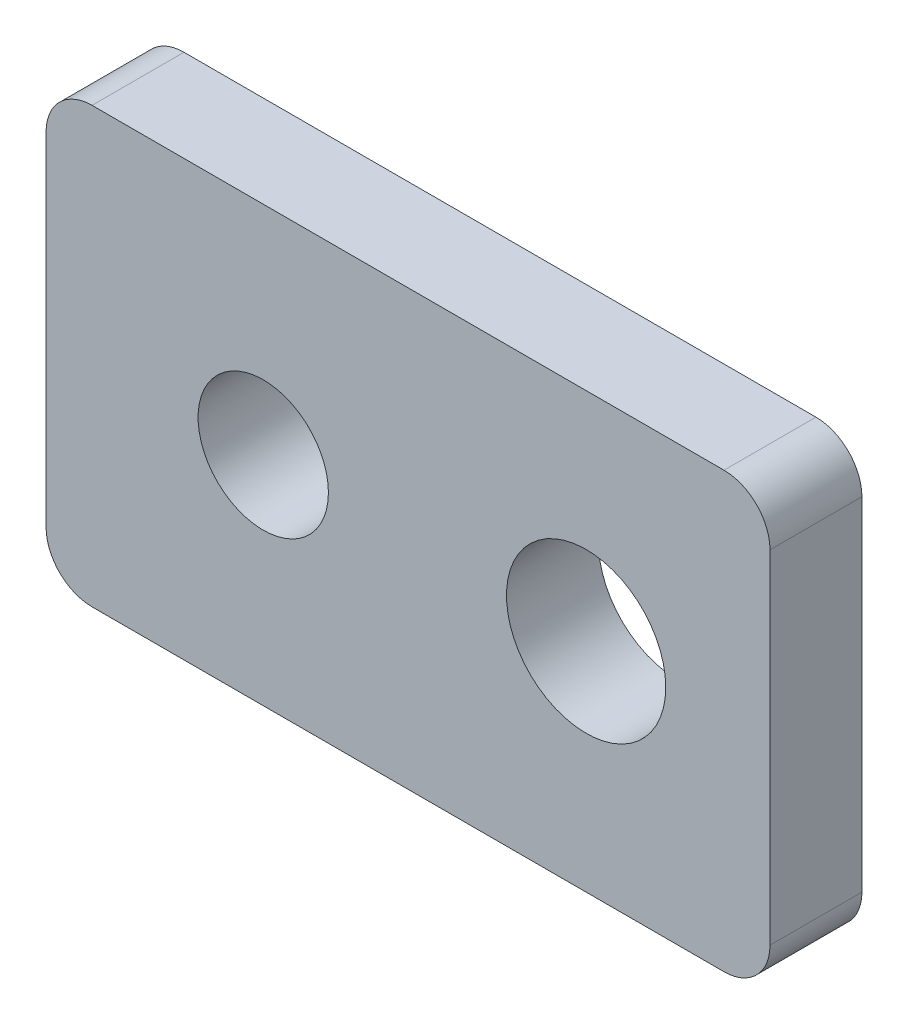
ISO-10303-21;
HEADER;
FILE_DESCRIPTION(('STEP AP214'),'2;1');
FILE_NAME('part.step','',(''),(''),'','','');
FILE_SCHEMA(('AUTOMOTIVE_DESIGN { 1 0 10303 214 1 1 1 1 }'));
ENDSEC;
DATA;
#1=APPLICATION_CONTEXT('core data for automotive mechanical design processes');
#2=APPLICATION_PROTOCOL_DEFINITION('international standard','automotive_design',2000,#1);
#3=PRODUCT_CONTEXT('',#1,'mechanical');
#4=PRODUCT('Part','Part','',(#3));
#5=PRODUCT_RELATED_PRODUCT_CATEGORY('part','',(#4));
#6=PRODUCT_DEFINITION_FORMATION('','',#4);
#7=PRODUCT_DEFINITION_CONTEXT('part definition',#1,'design');
#8=PRODUCT_DEFINITION('design','',#6,#7);
#9=PRODUCT_DEFINITION_SHAPE('','',#8);
#10=(LENGTH_UNIT() NAMED_UNIT(*) SI_UNIT(.MILLI.,.METRE.));
#11=(NAMED_UNIT(*) PLANE_ANGLE_UNIT() SI_UNIT($,.RADIAN.));
#12=(NAMED_UNIT(*) SI_UNIT($,.STERADIAN.) SOLID_ANGLE_UNIT());
#13=UNCERTAINTY_MEASURE_WITH_UNIT(LENGTH_MEASURE(1.E-05),#10,'distance_accuracy_value','');
#14=(GEOMETRIC_REPRESENTATION_CONTEXT(3) GLOBAL_UNCERTAINTY_ASSIGNED_CONTEXT((#13)) GLOBAL_UNIT_ASSIGNED_CONTEXT((#10,
#11,#12)) REPRESENTATION_CONTEXT('',''));
#15=CARTESIAN_POINT('',(0.,0.,0.));
#16=DIRECTION('',(0.,0.,1.));
#17=DIRECTION('',(1.,0.,0.));
#18=AXIS2_PLACEMENT_3D('',#15,#16,#17);
#19=CARTESIAN_POINT('',(12.5,0.,3.175));
#20=DIRECTION('',(1.,0.,0.));
#21=DIRECTION('',(0.,0.,-1.));
#22=AXIS2_PLACEMENT_3D('',#19,#20,#21);
#23=PLANE('',#22);
#24=DIRECTION('',(0.,-1.,0.));
#25=VECTOR('',#24,1.);
#26=CARTESIAN_POINT('',(12.5,0.,0.));
#27=LINE('',#26,#25);
#28=CARTESIAN_POINT('',(12.5,5.9125,0.));
#29=VERTEX_POINT('',#28);
#30=CARTESIAN_POINT('',(12.5,-5.9125,0.));
#31=VERTEX_POINT('',#30);
#32=EDGE_CURVE('E149',#29,#31,#27,.T.);
#33=ORIENTED_EDGE('',*,*,#32,.F.);
#34=DIRECTION('',(0.,0.,-1.));
#35=VECTOR('',#34,1.);
#36=CARTESIAN_POINT('',(12.5,5.9125,3.175));
#37=LINE('',#36,#35);
#38=CARTESIAN_POINT('',(12.5,5.9125,3.175));
#39=VERTEX_POINT('',#38);
#40=EDGE_CURVE('E11',#29,#39,#37,.F.);
#41=ORIENTED_EDGE('',*,*,#40,.T.);
#42=DIRECTION('',(0.,-1.,0.));
#43=VECTOR('',#42,1.);
#44=CARTESIAN_POINT('',(12.5,0.,3.175));
#45=LINE('',#44,#43);
#46=CARTESIAN_POINT('',(12.5,-5.9125,3.175));
#47=VERTEX_POINT('',#46);
#48=EDGE_CURVE('E147',#39,#47,#45,.T.);
#49=ORIENTED_EDGE('',*,*,#48,.T.);
#50=DIRECTION('',(0.,0.,-1.));
#51=VECTOR('',#50,1.);
#52=CARTESIAN_POINT('',(12.5,-5.9125,0.));
#53=LINE('',#52,#51);
#54=EDGE_CURVE('E56',#47,#31,#53,.T.);
#55=ORIENTED_EDGE('',*,*,#54,.T.);
#56=EDGE_LOOP('',(#33,#41,#49,#55));
#57=FACE_BOUND('',#56,.T.);
#58=ADVANCED_FACE('F47',(#57),#23,.T.);
#59=CARTESIAN_POINT('',(0.,7.5,3.175));
#60=DIRECTION('',(0.,1.,0.));
#61=DIRECTION('',(0.,0.,1.));
#62=AXIS2_PLACEMENT_3D('',#59,#60,#61);
#63=PLANE('',#62);
#64=DIRECTION('',(1.,0.,0.));
#65=VECTOR('',#64,1.);
#66=CARTESIAN_POINT('',(0.,7.5,0.));
#67=LINE('',#66,#65);
#68=CARTESIAN_POINT('',(-10.9125,7.5,0.));
#69=VERTEX_POINT('',#68);
#70=CARTESIAN_POINT('',(10.9125,7.5,0.));
#71=VERTEX_POINT('',#70);
#72=EDGE_CURVE('E143',#69,#71,#67,.T.);
#73=ORIENTED_EDGE('',*,*,#72,.F.);
#74=DIRECTION('',(0.,0.,-1.));
#75=VECTOR('',#74,1.);
#76=CARTESIAN_POINT('',(-10.9125,7.5,3.175));
#77=LINE('',#76,#75);
#78=CARTESIAN_POINT('',(-10.9125,7.5,3.175));
#79=VERTEX_POINT('',#78);
#80=EDGE_CURVE('E119',#69,#79,#77,.F.);
#81=ORIENTED_EDGE('',*,*,#80,.T.);
#82=DIRECTION('',(1.,0.,0.));
#83=VECTOR('',#82,1.);
#84=CARTESIAN_POINT('',(0.,7.5,3.175));
#85=LINE('',#84,#83);
#86=CARTESIAN_POINT('',(10.9125,7.5,3.175));
#87=VERTEX_POINT('',#86);
#88=EDGE_CURVE('E206',#79,#87,#85,.T.);
#89=ORIENTED_EDGE('',*,*,#88,.T.);
#90=DIRECTION('',(0.,0.,-1.));
#91=VECTOR('',#90,1.);
#92=CARTESIAN_POINT('',(10.9125,7.5,3.175));
#93=LINE('',#92,#91);
#94=EDGE_CURVE('E125',#87,#71,#93,.T.);
#95=ORIENTED_EDGE('',*,*,#94,.T.);
#96=EDGE_LOOP('',(#73,#81,#89,#95));
#97=FACE_BOUND('',#96,.T.);
#98=ADVANCED_FACE('F236',(#97),#63,.T.);
#99=CARTESIAN_POINT('',(-12.5,0.,3.175));
#100=DIRECTION('',(1.,0.,0.));
#101=DIRECTION('',(0.,0.,-1.));
#102=AXIS2_PLACEMENT_3D('',#99,#100,#101);
#103=PLANE('',#102);
#104=DIRECTION('',(0.,-1.,0.));
#105=VECTOR('',#104,1.);
#106=CARTESIAN_POINT('',(-12.5,0.,3.175));
#107=LINE('',#106,#105);
#108=CARTESIAN_POINT('',(-12.5,5.9125,3.175));
#109=VERTEX_POINT('',#108);
#110=CARTESIAN_POINT('',(-12.5,-5.9125,3.175));
#111=VERTEX_POINT('',#110);
#112=EDGE_CURVE('E134',#109,#111,#107,.T.);
#113=ORIENTED_EDGE('',*,*,#112,.F.);
#114=DIRECTION('',(0.,0.,-1.));
#115=VECTOR('',#114,1.);
#116=CARTESIAN_POINT('',(-12.5,5.9125,0.));
#117=LINE('',#116,#115);
#118=CARTESIAN_POINT('',(-12.5,5.9125,0.));
#119=VERTEX_POINT('',#118);
#120=EDGE_CURVE('E118',#109,#119,#117,.T.);
#121=ORIENTED_EDGE('',*,*,#120,.T.);
#122=DIRECTION('',(0.,-1.,0.));
#123=VECTOR('',#122,1.);
#124=CARTESIAN_POINT('',(-12.5,0.,0.));
#125=LINE('',#124,#123);
#126=CARTESIAN_POINT('',(-12.5,-5.9125,0.));
#127=VERTEX_POINT('',#126);
#128=EDGE_CURVE('E132',#119,#127,#125,.T.);
#129=ORIENTED_EDGE('',*,*,#128,.T.);
#130=DIRECTION('',(0.,0.,-1.));
#131=VECTOR('',#130,1.);
#132=CARTESIAN_POINT('',(-12.5,-5.9125,3.175));
#133=LINE('',#132,#131);
#134=EDGE_CURVE('E137',#127,#111,#133,.F.);
#135=ORIENTED_EDGE('',*,*,#134,.T.);
#136=EDGE_LOOP('',(#113,#121,#129,#135));
#137=FACE_BOUND('',#136,.T.);
#138=ADVANCED_FACE('F131',(#137),#103,.F.);
#139=CARTESIAN_POINT('',(0.,-7.5,3.175));
#140=DIRECTION('',(0.,1.,0.));
#141=DIRECTION('',(0.,0.,1.));
#142=AXIS2_PLACEMENT_3D('',#139,#140,#141);
#143=PLANE('',#142);
#144=DIRECTION('',(1.,0.,0.));
#145=VECTOR('',#144,1.);
#146=CARTESIAN_POINT('',(0.,-7.5,3.175));
#147=LINE('',#146,#145);
#148=CARTESIAN_POINT('',(-10.9125,-7.5,3.175));
#149=VERTEX_POINT('',#148);
#150=CARTESIAN_POINT('',(10.9125,-7.5,3.175));
#151=VERTEX_POINT('',#150);
#152=EDGE_CURVE('E154',#149,#151,#147,.T.);
#153=ORIENTED_EDGE('',*,*,#152,.F.);
#154=DIRECTION('',(0.,0.,-1.));
#155=VECTOR('',#154,1.);
#156=CARTESIAN_POINT('',(-10.9125,-7.5,3.175));
#157=LINE('',#156,#155);
#158=CARTESIAN_POINT('',(-10.9125,-7.5,0.));
#159=VERTEX_POINT('',#158);
#160=EDGE_CURVE('E181',#149,#159,#157,.T.);
#161=ORIENTED_EDGE('',*,*,#160,.T.);
#162=DIRECTION('',(1.,0.,0.));
#163=VECTOR('',#162,1.);
#164=CARTESIAN_POINT('',(0.,-7.5,0.));
#165=LINE('',#164,#163);
#166=CARTESIAN_POINT('',(10.9125,-7.5,0.));
#167=VERTEX_POINT('',#166);
#168=EDGE_CURVE('E142',#159,#167,#165,.T.);
#169=ORIENTED_EDGE('',*,*,#168,.T.);
#170=DIRECTION('',(0.,0.,-1.));
#171=VECTOR('',#170,1.);
#172=CARTESIAN_POINT('',(10.9125,-7.5,3.175));
#173=LINE('',#172,#171);
#174=EDGE_CURVE('E63',#167,#151,#173,.F.);
#175=ORIENTED_EDGE('',*,*,#174,.T.);
#176=EDGE_LOOP('',(#153,#161,#169,#175));
#177=FACE_BOUND('',#176,.T.);
#178=ADVANCED_FACE('F229',(#177),#143,.F.);
#179=CARTESIAN_POINT('',(0.,0.,3.175));
#180=DIRECTION('',(0.,0.,1.));
#181=DIRECTION('',(1.,0.,0.));
#182=AXIS2_PLACEMENT_3D('',#179,#180,#181);
#183=PLANE('',#182);
#184=CARTESIAN_POINT('',(-4.99999999999994,0.,3.175));
#185=DIRECTION('',(0.,0.,1.));
#186=DIRECTION('',(1.,0.,0.));
#187=AXIS2_PLACEMENT_3D('',#184,#185,#186);
#188=CIRCLE('',#187,2.24999999999999);
#189=CARTESIAN_POINT('',(-2.74999999999995,0.,3.175));
#190=VERTEX_POINT('',#189);
#191=EDGE_CURVE('E219',#190,#190,#188,.T.);
#192=ORIENTED_EDGE('',*,*,#191,.F.);
#193=EDGE_LOOP('',(#192));
#194=FACE_BOUND('',#193,.T.);
#195=CARTESIAN_POINT('',(6.14999999999999,0.,3.175));
#196=DIRECTION('',(0.,0.,1.));
#197=DIRECTION('',(1.,0.,0.));
#198=AXIS2_PLACEMENT_3D('',#195,#196,#197);
#199=CIRCLE('',#198,2.75);
#200=CARTESIAN_POINT('',(8.89999999999999,0.,3.175));
#201=VERTEX_POINT('',#200);
#202=EDGE_CURVE('E199',#201,#201,#199,.T.);
#203=ORIENTED_EDGE('',*,*,#202,.F.);
#204=EDGE_LOOP('',(#203));
#205=FACE_BOUND('',#204,.T.);
#206=ORIENTED_EDGE('',*,*,#88,.F.);
#207=CARTESIAN_POINT('',(-10.9125,5.9125,3.175));
#208=DIRECTION('',(0.,0.,1.));
#209=DIRECTION('',(1.,0.,0.));
#210=AXIS2_PLACEMENT_3D('',#207,#208,#209);
#211=CIRCLE('',#210,1.5875);
#212=EDGE_CURVE('E176',#79,#109,#211,.T.);
#213=ORIENTED_EDGE('',*,*,#212,.T.);
#214=ORIENTED_EDGE('',*,*,#112,.T.);
#215=CARTESIAN_POINT('',(-10.9125,-5.9125,3.175));
#216=DIRECTION('',(0.,0.,1.));
#217=DIRECTION('',(1.,0.,0.));
#218=AXIS2_PLACEMENT_3D('',#215,#216,#217);
#219=CIRCLE('',#218,1.5875);
#220=EDGE_CURVE('E70',#111,#149,#219,.T.);
#221=ORIENTED_EDGE('',*,*,#220,.T.);
#222=ORIENTED_EDGE('',*,*,#152,.T.);
#223=CARTESIAN_POINT('',(10.9125,-5.9125,3.175));
#224=DIRECTION('',(0.,0.,1.));
#225=DIRECTION('',(1.,0.,0.));
#226=AXIS2_PLACEMENT_3D('',#223,#224,#225);
#227=CIRCLE('',#226,1.5875);
#228=EDGE_CURVE('E168',#151,#47,#227,.T.);
#229=ORIENTED_EDGE('',*,*,#228,.T.);
#230=ORIENTED_EDGE('',*,*,#48,.F.);
#231=CARTESIAN_POINT('',(10.9125,5.9125,3.175));
#232=DIRECTION('',(0.,0.,1.));
#233=DIRECTION('',(1.,0.,0.));
#234=AXIS2_PLACEMENT_3D('',#231,#232,#233);
#235=CIRCLE('',#234,1.5875);
#236=EDGE_CURVE('E171',#39,#87,#235,.T.);
#237=ORIENTED_EDGE('',*,*,#236,.T.);
#238=EDGE_LOOP('',(#206,#213,#214,#221,#222,#229,#230,#237));
#239=FACE_BOUND('',#238,.T.);
#240=ADVANCED_FACE('F226',(#194,#205,#239),#183,.T.);
#241=CARTESIAN_POINT('',(0.,0.,0.));
#242=DIRECTION('',(0.,0.,1.));
#243=DIRECTION('',(1.,0.,0.));
#244=AXIS2_PLACEMENT_3D('',#241,#242,#243);
#245=PLANE('',#244);
#246=CARTESIAN_POINT('',(-4.99999999999994,0.,0.));
#247=DIRECTION('',(0.,0.,1.));
#248=DIRECTION('',(1.,0.,0.));
#249=AXIS2_PLACEMENT_3D('',#246,#247,#248);
#250=CIRCLE('',#249,2.25);
#251=CARTESIAN_POINT('',(-2.74999999999994,0.,0.));
#252=VERTEX_POINT('',#251);
#253=EDGE_CURVE('E215',#252,#252,#250,.T.);
#254=ORIENTED_EDGE('',*,*,#253,.T.);
#255=EDGE_LOOP('',(#254));
#256=FACE_BOUND('',#255,.T.);
#257=CARTESIAN_POINT('',(6.14999999999999,0.,0.));
#258=DIRECTION('',(0.,0.,1.));
#259=DIRECTION('',(1.,0.,0.));
#260=AXIS2_PLACEMENT_3D('',#257,#258,#259);
#261=CIRCLE('',#260,2.75);
#262=CARTESIAN_POINT('',(8.89999999999999,0.,0.));
#263=VERTEX_POINT('',#262);
#264=EDGE_CURVE('E196',#263,#263,#261,.T.);
#265=ORIENTED_EDGE('',*,*,#264,.T.);
#266=EDGE_LOOP('',(#265));
#267=FACE_BOUND('',#266,.T.);
#268=ORIENTED_EDGE('',*,*,#128,.F.);
#269=CARTESIAN_POINT('',(-10.9125,5.9125,0.));
#270=DIRECTION('',(0.,0.,1.));
#271=DIRECTION('',(1.,0.,0.));
#272=AXIS2_PLACEMENT_3D('',#269,#270,#271);
#273=CIRCLE('',#272,1.5875);
#274=EDGE_CURVE('E114',#119,#69,#273,.F.);
#275=ORIENTED_EDGE('',*,*,#274,.T.);
#276=ORIENTED_EDGE('',*,*,#72,.T.);
#277=CARTESIAN_POINT('',(10.9125,5.9125,0.));
#278=DIRECTION('',(0.,0.,1.));
#279=DIRECTION('',(1.,0.,0.));
#280=AXIS2_PLACEMENT_3D('',#277,#278,#279);
#281=CIRCLE('',#280,1.5875);
#282=EDGE_CURVE('E158',#71,#29,#281,.F.);
#283=ORIENTED_EDGE('',*,*,#282,.T.);
#284=ORIENTED_EDGE('',*,*,#32,.T.);
#285=CARTESIAN_POINT('',(10.9125,-5.9125,0.));
#286=DIRECTION('',(0.,0.,1.));
#287=DIRECTION('',(1.,0.,0.));
#288=AXIS2_PLACEMENT_3D('',#285,#286,#287);
#289=CIRCLE('',#288,1.5875);
#290=EDGE_CURVE('E136',#31,#167,#289,.F.);
#291=ORIENTED_EDGE('',*,*,#290,.T.);
#292=ORIENTED_EDGE('',*,*,#168,.F.);
#293=CARTESIAN_POINT('',(-10.9125,-5.9125,0.));
#294=DIRECTION('',(0.,0.,1.));
#295=DIRECTION('',(1.,0.,0.));
#296=AXIS2_PLACEMENT_3D('',#293,#294,#295);
#297=CIRCLE('',#296,1.5875);
#298=EDGE_CURVE('E126',#159,#127,#297,.F.);
#299=ORIENTED_EDGE('',*,*,#298,.T.);
#300=EDGE_LOOP('',(#268,#275,#276,#283,#284,#291,#292,#299));
#301=FACE_BOUND('',#300,.T.);
#302=ADVANCED_FACE('F139',(#256,#267,#301),#245,.F.);
#303=CARTESIAN_POINT('',(6.14999999999999,0.,3.175));
#304=DIRECTION('',(0.,0.,1.));
#305=DIRECTION('',(1.,0.,0.));
#306=AXIS2_PLACEMENT_3D('',#303,#304,#305);
#307=CYLINDRICAL_SURFACE('',#306,2.75);
#308=ORIENTED_EDGE('',*,*,#264,.F.);
#309=EDGE_LOOP('',(#308));
#310=FACE_BOUND('',#309,.T.);
#311=ORIENTED_EDGE('',*,*,#202,.T.);
#312=EDGE_LOOP('',(#311));
#313=FACE_BOUND('',#312,.T.);
#314=ADVANCED_FACE('F258',(#310,#313),#307,.F.);
#315=CARTESIAN_POINT('',(-10.9125,5.9125,3.175));
#316=DIRECTION('',(0.,0.,1.));
#317=DIRECTION('',(1.,0.,0.));
#318=AXIS2_PLACEMENT_3D('',#315,#316,#317);
#319=CYLINDRICAL_SURFACE('',#318,1.5875);
#320=ORIENTED_EDGE('',*,*,#212,.F.);
#321=ORIENTED_EDGE('',*,*,#80,.F.);
#322=ORIENTED_EDGE('',*,*,#274,.F.);
#323=ORIENTED_EDGE('',*,*,#120,.F.);
#324=EDGE_LOOP('',(#320,#321,#322,#323));
#325=FACE_BOUND('',#324,.T.);
#326=ADVANCED_FACE('F117',(#325),#319,.T.);
#327=CARTESIAN_POINT('',(-10.9125,-5.9125,3.175));
#328=DIRECTION('',(0.,0.,-1.));
#329=DIRECTION('',(-1.,0.,0.));
#330=AXIS2_PLACEMENT_3D('',#327,#328,#329);
#331=CYLINDRICAL_SURFACE('',#330,1.5875);
#332=ORIENTED_EDGE('',*,*,#220,.F.);
#333=ORIENTED_EDGE('',*,*,#134,.F.);
#334=ORIENTED_EDGE('',*,*,#298,.F.);
#335=ORIENTED_EDGE('',*,*,#160,.F.);
#336=EDGE_LOOP('',(#332,#333,#334,#335));
#337=FACE_BOUND('',#336,.T.);
#338=ADVANCED_FACE('F246',(#337),#331,.T.);
#339=CARTESIAN_POINT('',(10.9125,5.9125,3.175));
#340=DIRECTION('',(0.,0.,-1.));
#341=DIRECTION('',(-1.,0.,0.));
#342=AXIS2_PLACEMENT_3D('',#339,#340,#341);
#343=CYLINDRICAL_SURFACE('',#342,1.5875);
#344=ORIENTED_EDGE('',*,*,#236,.F.);
#345=ORIENTED_EDGE('',*,*,#40,.F.);
#346=ORIENTED_EDGE('',*,*,#282,.F.);
#347=ORIENTED_EDGE('',*,*,#94,.F.);
#348=EDGE_LOOP('',(#344,#345,#346,#347));
#349=FACE_BOUND('',#348,.T.);
#350=ADVANCED_FACE('F238',(#349),#343,.T.);
#351=CARTESIAN_POINT('',(10.9125,-5.9125,3.175));
#352=DIRECTION('',(0.,0.,1.));
#353=DIRECTION('',(1.,0.,0.));
#354=AXIS2_PLACEMENT_3D('',#351,#352,#353);
#355=CYLINDRICAL_SURFACE('',#354,1.5875);
#356=ORIENTED_EDGE('',*,*,#228,.F.);
#357=ORIENTED_EDGE('',*,*,#174,.F.);
#358=ORIENTED_EDGE('',*,*,#290,.F.);
#359=ORIENTED_EDGE('',*,*,#54,.F.);
#360=EDGE_LOOP('',(#356,#357,#358,#359));
#361=FACE_BOUND('',#360,.T.);
#362=ADVANCED_FACE('F49',(#361),#355,.T.);
#363=CARTESIAN_POINT('',(-4.99999999999994,0.,3.175));
#364=DIRECTION('',(0.,0.,1.));
#365=DIRECTION('',(1.,0.,0.));
#366=AXIS2_PLACEMENT_3D('',#363,#364,#365);
#367=CYLINDRICAL_SURFACE('',#366,2.24999999999999);
#368=ORIENTED_EDGE('',*,*,#253,.F.);
#369=EDGE_LOOP('',(#368));
#370=FACE_BOUND('',#369,.T.);
#371=ORIENTED_EDGE('',*,*,#191,.T.);
#372=EDGE_LOOP('',(#371));
#373=FACE_BOUND('',#372,.T.);
#374=ADVANCED_FACE('F224',(#370,#373),#367,.F.);
#375=CLOSED_SHELL('',(#58,#98,#138,#178,#240,#302,#314,#326,#338,#350,#362,#374));
#376=MANIFOLD_SOLID_BREP('B2',#375);
#377=ADVANCED_BREP_SHAPE_REPRESENTATION('',(#18,#376),#14);
#378=SHAPE_DEFINITION_REPRESENTATION(#9,#377);
ENDSEC;
END-ISO-10303-21;
